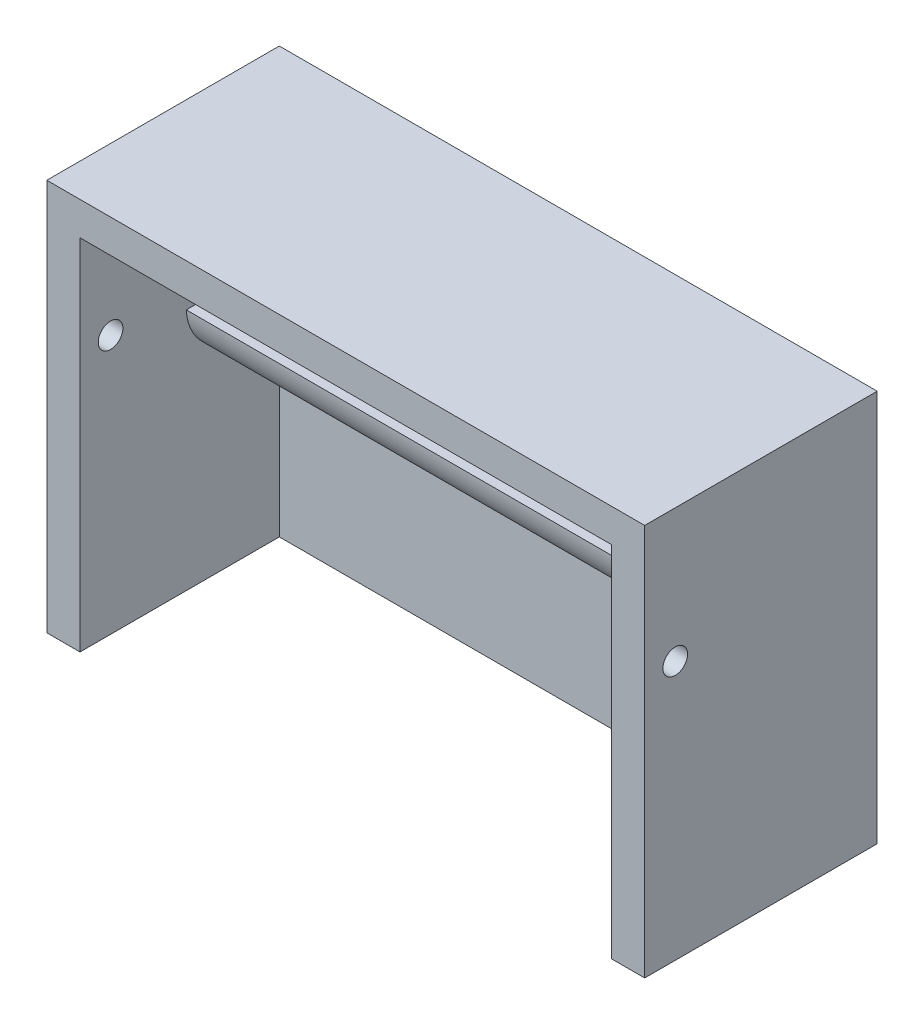
ISO-10303-21;
HEADER;
FILE_DESCRIPTION(('STEP AP214'),'2;1');
FILE_NAME('part.step','',(''),(''),'','','');
FILE_SCHEMA(('AUTOMOTIVE_DESIGN { 1 0 10303 214 1 1 1 1 }'));
ENDSEC;
DATA;
#1=APPLICATION_CONTEXT('core data for automotive mechanical design processes');
#2=APPLICATION_PROTOCOL_DEFINITION('international standard','automotive_design',2000,#1);
#3=PRODUCT_CONTEXT('',#1,'mechanical');
#4=PRODUCT('Part','Part','',(#3));
#5=PRODUCT_RELATED_PRODUCT_CATEGORY('part','',(#4));
#6=PRODUCT_DEFINITION_FORMATION('','',#4);
#7=PRODUCT_DEFINITION_CONTEXT('part definition',#1,'design');
#8=PRODUCT_DEFINITION('design','',#6,#7);
#9=PRODUCT_DEFINITION_SHAPE('','',#8);
#10=(LENGTH_UNIT() NAMED_UNIT(*) SI_UNIT(.MILLI.,.METRE.));
#11=(NAMED_UNIT(*) PLANE_ANGLE_UNIT() SI_UNIT($,.RADIAN.));
#12=(NAMED_UNIT(*) SI_UNIT($,.STERADIAN.) SOLID_ANGLE_UNIT());
#13=UNCERTAINTY_MEASURE_WITH_UNIT(LENGTH_MEASURE(1.E-05),#10,'distance_accuracy_value','');
#14=(GEOMETRIC_REPRESENTATION_CONTEXT(3) GLOBAL_UNCERTAINTY_ASSIGNED_CONTEXT((#13)) GLOBAL_UNIT_ASSIGNED_CONTEXT((#10,
#11,#12)) REPRESENTATION_CONTEXT('',''));
#15=CARTESIAN_POINT('',(0.,0.,0.));
#16=DIRECTION('',(0.,0.,1.));
#17=DIRECTION('',(1.,0.,0.));
#18=AXIS2_PLACEMENT_3D('',#15,#16,#17);
#19=CARTESIAN_POINT('',(50.8,43.9310288968519,44.45));
#20=DIRECTION('',(1.,0.,0.));
#21=DIRECTION('',(0.,0.,-1.));
#22=AXIS2_PLACEMENT_3D('',#19,#20,#21);
#23=PLANE('',#22);
#24=CARTESIAN_POINT('',(50.8,24.8810288968519,38.608));
#25=DIRECTION('',(1.,0.,0.));
#26=DIRECTION('',(0.,0.,-1.));
#27=AXIS2_PLACEMENT_3D('',#24,#25,#26);
#28=CIRCLE('',#27,2.35585);
#29=CARTESIAN_POINT('',(50.8,27.2368788968519,38.608));
#30=VERTEX_POINT('',#29);
#31=EDGE_CURVE('E164',#30,#30,#28,.F.);
#32=ORIENTED_EDGE('',*,*,#31,.F.);
#33=EDGE_LOOP('',(#32));
#34=FACE_BOUND('',#33,.T.);
#35=DIRECTION('',(0.,0.,-1.));
#36=VECTOR('',#35,1.);
#37=CARTESIAN_POINT('',(50.8,21.8330288968519,24.13));
#38=LINE('',#37,#36);
#39=CARTESIAN_POINT('',(50.8,21.8330288968519,24.13));
#40=VERTEX_POINT('',#39);
#41=CARTESIAN_POINT('',(50.8,21.8330288968519,6.35));
#42=VERTEX_POINT('',#41);
#43=EDGE_CURVE('E239',#40,#42,#38,.T.);
#44=ORIENTED_EDGE('',*,*,#43,.F.);
#45=CARTESIAN_POINT('',(50.8,22.3410288968519,13.9827079474374));
#46=DIRECTION('',(1.,0.,0.));
#47=DIRECTION('',(0.,0.,-1.));
#48=AXIS2_PLACEMENT_3D('',#45,#46,#47);
#49=CIRCLE('',#48,10.16);
#50=CARTESIAN_POINT('',(50.8,12.1810288968519,13.9827079474374));
#51=VERTEX_POINT('',#50);
#52=EDGE_CURVE('E45',#40,#51,#49,.T.);
#53=ORIENTED_EDGE('',*,*,#52,.T.);
#54=DIRECTION('',(0.,0.,-1.));
#55=VECTOR('',#54,1.);
#56=CARTESIAN_POINT('',(50.8,12.1810288968519,24.13));
#57=LINE('',#56,#55);
#58=CARTESIAN_POINT('',(50.8,12.1810288968519,6.35));
#59=VERTEX_POINT('',#58);
#60=EDGE_CURVE('E237',#51,#59,#57,.T.);
#61=ORIENTED_EDGE('',*,*,#60,.T.);
#62=DIRECTION('',(0.,1.,0.));
#63=VECTOR('',#62,1.);
#64=CARTESIAN_POINT('',(50.8,-24.6489711031481,6.35));
#65=LINE('',#64,#63);
#66=CARTESIAN_POINT('',(50.8,-24.6489711031481,6.35));
#67=VERTEX_POINT('',#66);
#68=EDGE_CURVE('E173',#67,#59,#65,.T.);
#69=ORIENTED_EDGE('',*,*,#68,.F.);
#70=DIRECTION('',(0.,0.,-1.));
#71=VECTOR('',#70,1.);
#72=CARTESIAN_POINT('',(50.8,-24.6489711031481,44.45));
#73=LINE('',#72,#71);
#74=CARTESIAN_POINT('',(50.8,-24.6489711031481,44.45));
#75=VERTEX_POINT('',#74);
#76=EDGE_CURVE('E195',#75,#67,#73,.T.);
#77=ORIENTED_EDGE('',*,*,#76,.F.);
#78=DIRECTION('',(0.,-1.,0.));
#79=VECTOR('',#78,1.);
#80=CARTESIAN_POINT('',(50.8,43.9310288968519,44.45));
#81=LINE('',#80,#79);
#82=CARTESIAN_POINT('',(50.8,43.9310288968519,44.45));
#83=VERTEX_POINT('',#82);
#84=EDGE_CURVE('E183',#83,#75,#81,.T.);
#85=ORIENTED_EDGE('',*,*,#84,.F.);
#86=DIRECTION('',(0.,0.,-1.));
#87=VECTOR('',#86,1.);
#88=CARTESIAN_POINT('',(50.8,43.9310288968519,44.45));
#89=LINE('',#88,#87);
#90=CARTESIAN_POINT('',(50.8,43.9310288968519,6.35));
#91=VERTEX_POINT('',#90);
#92=EDGE_CURVE('E198',#83,#91,#89,.T.);
#93=ORIENTED_EDGE('',*,*,#92,.T.);
#94=EDGE_CURVE('E170',#42,#91,#65,.T.);
#95=ORIENTED_EDGE('',*,*,#94,.F.);
#96=EDGE_LOOP('',(#44,#53,#61,#69,#77,#85,#93,#95));
#97=FACE_BOUND('',#96,.T.);
#98=ADVANCED_FACE('F37',(#34,#97),#23,.F.);
#99=CARTESIAN_POINT('',(0.,-24.6489711031481,6.35));
#100=DIRECTION('',(0.,0.,-1.));
#101=DIRECTION('',(-1.,0.,0.));
#102=AXIS2_PLACEMENT_3D('',#99,#100,#101);
#103=PLANE('',#102);
#104=DIRECTION('',(1.,0.,0.));
#105=VECTOR('',#104,1.);
#106=CARTESIAN_POINT('',(-50.8,12.1810288968519,6.35));
#107=LINE('',#106,#105);
#108=CARTESIAN_POINT('',(-50.8,12.1810288968519,6.35));
#109=VERTEX_POINT('',#108);
#110=EDGE_CURVE('E225',#109,#59,#107,.T.);
#111=ORIENTED_EDGE('',*,*,#110,.F.);
#112=DIRECTION('',(0.,1.,0.));
#113=VECTOR('',#112,1.);
#114=CARTESIAN_POINT('',(-50.8,-24.6489711031481,6.35));
#115=LINE('',#114,#113);
#116=CARTESIAN_POINT('',(-50.8,-24.6489711031481,6.35));
#117=VERTEX_POINT('',#116);
#118=EDGE_CURVE('E156',#117,#109,#115,.T.);
#119=ORIENTED_EDGE('',*,*,#118,.F.);
#120=DIRECTION('',(-1.,0.,0.));
#121=VECTOR('',#120,1.);
#122=CARTESIAN_POINT('',(0.,-24.6489711031481,6.35));
#123=LINE('',#122,#121);
#124=EDGE_CURVE('E168',#67,#117,#123,.T.);
#125=ORIENTED_EDGE('',*,*,#124,.F.);
#126=ORIENTED_EDGE('',*,*,#68,.T.);
#127=EDGE_LOOP('',(#111,#119,#125,#126));
#128=FACE_BOUND('',#127,.T.);
#129=ADVANCED_FACE('F222',(#128),#103,.F.);
#130=DIRECTION('',(-1.,0.,0.));
#131=VECTOR('',#130,1.);
#132=CARTESIAN_POINT('',(-50.8,21.8330288968519,6.35));
#133=LINE('',#132,#131);
#134=CARTESIAN_POINT('',(-50.8,21.8330288968519,6.35));
#135=VERTEX_POINT('',#134);
#136=EDGE_CURVE('E245',#42,#135,#133,.T.);
#137=ORIENTED_EDGE('',*,*,#136,.F.);
#138=ORIENTED_EDGE('',*,*,#94,.T.);
#139=DIRECTION('',(-1.,0.,0.));
#140=VECTOR('',#139,1.);
#141=CARTESIAN_POINT('',(0.,43.9310288968519,6.35));
#142=LINE('',#141,#140);
#143=CARTESIAN_POINT('',(-50.8,43.9310288968519,6.35));
#144=VERTEX_POINT('',#143);
#145=EDGE_CURVE('E167',#91,#144,#142,.T.);
#146=ORIENTED_EDGE('',*,*,#145,.T.);
#147=EDGE_CURVE('E227',#135,#144,#115,.T.);
#148=ORIENTED_EDGE('',*,*,#147,.F.);
#149=EDGE_LOOP('',(#137,#138,#146,#148));
#150=FACE_BOUND('',#149,.T.);
#151=ADVANCED_FACE('F260',(#150),#103,.F.);
#152=CARTESIAN_POINT('',(-50.8,43.9310288968519,44.45));
#153=DIRECTION('',(1.,0.,0.));
#154=DIRECTION('',(0.,0.,-1.));
#155=AXIS2_PLACEMENT_3D('',#152,#153,#154);
#156=PLANE('',#155);
#157=CARTESIAN_POINT('',(-50.8,24.8810288968519,38.608));
#158=DIRECTION('',(1.,0.,0.));
#159=DIRECTION('',(0.,0.,-1.));
#160=AXIS2_PLACEMENT_3D('',#157,#158,#159);
#161=CIRCLE('',#160,2.35585);
#162=CARTESIAN_POINT('',(-50.8,24.8810288968519,36.25215));
#163=VERTEX_POINT('',#162);
#164=EDGE_CURVE('E228',#163,#163,#161,.T.);
#165=ORIENTED_EDGE('',*,*,#164,.F.);
#166=EDGE_LOOP('',(#165));
#167=FACE_BOUND('',#166,.T.);
#168=ORIENTED_EDGE('',*,*,#118,.T.);
#169=DIRECTION('',(0.,0.,-1.));
#170=VECTOR('',#169,1.);
#171=CARTESIAN_POINT('',(-50.8,12.1810288968519,24.13));
#172=LINE('',#171,#170);
#173=CARTESIAN_POINT('',(-50.8,12.1810288968519,13.9827079474374));
#174=VERTEX_POINT('',#173);
#175=EDGE_CURVE('E235',#174,#109,#172,.T.);
#176=ORIENTED_EDGE('',*,*,#175,.F.);
#177=CARTESIAN_POINT('',(-50.8,22.3410288968519,13.9827079474374));
#178=DIRECTION('',(1.,0.,0.));
#179=DIRECTION('',(0.,0.,-1.));
#180=AXIS2_PLACEMENT_3D('',#177,#178,#179);
#181=CIRCLE('',#180,10.16);
#182=CARTESIAN_POINT('',(-50.8,21.8330288968519,24.13));
#183=VERTEX_POINT('',#182);
#184=EDGE_CURVE('E11',#174,#183,#181,.F.);
#185=ORIENTED_EDGE('',*,*,#184,.T.);
#186=DIRECTION('',(0.,0.,-1.));
#187=VECTOR('',#186,1.);
#188=CARTESIAN_POINT('',(-50.8,21.8330288968519,24.13));
#189=LINE('',#188,#187);
#190=EDGE_CURVE('E242',#183,#135,#189,.T.);
#191=ORIENTED_EDGE('',*,*,#190,.T.);
#192=ORIENTED_EDGE('',*,*,#147,.T.);
#193=DIRECTION('',(0.,0.,-1.));
#194=VECTOR('',#193,1.);
#195=CARTESIAN_POINT('',(-50.8,43.9310288968519,44.45));
#196=LINE('',#195,#194);
#197=CARTESIAN_POINT('',(-50.8,43.9310288968519,44.45));
#198=VERTEX_POINT('',#197);
#199=EDGE_CURVE('E158',#198,#144,#196,.T.);
#200=ORIENTED_EDGE('',*,*,#199,.F.);
#201=DIRECTION('',(0.,-1.,0.));
#202=VECTOR('',#201,1.);
#203=CARTESIAN_POINT('',(-50.8,43.9310288968519,44.45));
#204=LINE('',#203,#202);
#205=CARTESIAN_POINT('',(-50.8,-24.6489711031481,44.45));
#206=VERTEX_POINT('',#205);
#207=EDGE_CURVE('E149',#198,#206,#204,.T.);
#208=ORIENTED_EDGE('',*,*,#207,.T.);
#209=DIRECTION('',(0.,0.,-1.));
#210=VECTOR('',#209,1.);
#211=CARTESIAN_POINT('',(-50.8,-24.6489711031481,44.45));
#212=LINE('',#211,#210);
#213=EDGE_CURVE('E135',#206,#117,#212,.T.);
#214=ORIENTED_EDGE('',*,*,#213,.T.);
#215=EDGE_LOOP('',(#168,#176,#185,#191,#192,#200,#208,#214));
#216=FACE_BOUND('',#215,.T.);
#217=ADVANCED_FACE('F257',(#167,#216),#156,.T.);
#218=CARTESIAN_POINT('',(0.,43.9310288968519,44.45));
#219=DIRECTION('',(0.,1.,0.));
#220=DIRECTION('',(0.,0.,1.));
#221=AXIS2_PLACEMENT_3D('',#218,#219,#220);
#222=PLANE('',#221);
#223=ORIENTED_EDGE('',*,*,#199,.T.);
#224=ORIENTED_EDGE('',*,*,#145,.F.);
#225=ORIENTED_EDGE('',*,*,#92,.F.);
#226=DIRECTION('',(1.,0.,0.));
#227=VECTOR('',#226,1.);
#228=CARTESIAN_POINT('',(0.,43.9310288968519,44.45));
#229=LINE('',#228,#227);
#230=EDGE_CURVE('E181',#198,#83,#229,.T.);
#231=ORIENTED_EDGE('',*,*,#230,.F.);
#232=EDGE_LOOP('',(#223,#224,#225,#231));
#233=FACE_BOUND('',#232,.T.);
#234=ADVANCED_FACE('F264',(#233),#222,.F.);
#235=CARTESIAN_POINT('',(57.15,-24.6489711031481,44.45));
#236=DIRECTION('',(-1.,0.,0.));
#237=DIRECTION('',(0.,-1.,0.));
#238=AXIS2_PLACEMENT_3D('',#235,#236,#237);
#239=PLANE('',#238);
#240=CARTESIAN_POINT('',(57.15,24.8810288968519,38.608));
#241=DIRECTION('',(1.,0.,0.));
#242=DIRECTION('',(0.,1.,0.));
#243=AXIS2_PLACEMENT_3D('',#240,#241,#242);
#244=CIRCLE('',#243,2.35585);
#245=CARTESIAN_POINT('',(57.15,27.2368788968519,38.608));
#246=VERTEX_POINT('',#245);
#247=EDGE_CURVE('E134',#246,#246,#244,.T.);
#248=ORIENTED_EDGE('',*,*,#247,.F.);
#249=EDGE_LOOP('',(#248));
#250=FACE_BOUND('',#249,.T.);
#251=DIRECTION('',(0.,1.,0.));
#252=VECTOR('',#251,1.);
#253=CARTESIAN_POINT('',(57.15,-24.6489711031481,0.));
#254=LINE('',#253,#252);
#255=CARTESIAN_POINT('',(57.15,-24.6489711031481,0.));
#256=VERTEX_POINT('',#255);
#257=CARTESIAN_POINT('',(57.15,50.2810288968519,0.));
#258=VERTEX_POINT('',#257);
#259=EDGE_CURVE('E176',#256,#258,#254,.T.);
#260=ORIENTED_EDGE('',*,*,#259,.T.);
#261=DIRECTION('',(0.,0.,-1.));
#262=VECTOR('',#261,1.);
#263=CARTESIAN_POINT('',(57.15,50.2810288968519,44.45));
#264=LINE('',#263,#262);
#265=CARTESIAN_POINT('',(57.15,50.2810288968519,44.45));
#266=VERTEX_POINT('',#265);
#267=EDGE_CURVE('E201',#266,#258,#264,.T.);
#268=ORIENTED_EDGE('',*,*,#267,.F.);
#269=DIRECTION('',(0.,1.,0.));
#270=VECTOR('',#269,1.);
#271=CARTESIAN_POINT('',(57.15,-24.6489711031481,44.45));
#272=LINE('',#271,#270);
#273=CARTESIAN_POINT('',(57.15,-24.6489711031481,44.45));
#274=VERTEX_POINT('',#273);
#275=EDGE_CURVE('E177',#274,#266,#272,.T.);
#276=ORIENTED_EDGE('',*,*,#275,.F.);
#277=DIRECTION('',(0.,0.,-1.));
#278=VECTOR('',#277,1.);
#279=CARTESIAN_POINT('',(57.15,-24.6489711031481,44.45));
#280=LINE('',#279,#278);
#281=EDGE_CURVE('E187',#274,#256,#280,.T.);
#282=ORIENTED_EDGE('',*,*,#281,.T.);
#283=EDGE_LOOP('',(#260,#268,#276,#282));
#284=FACE_BOUND('',#283,.T.);
#285=ADVANCED_FACE('F210',(#250,#284),#239,.F.);
#286=CARTESIAN_POINT('',(57.15,50.2810288968519,44.45));
#287=DIRECTION('',(0.,-1.,0.));
#288=DIRECTION('',(1.,0.,0.));
#289=AXIS2_PLACEMENT_3D('',#286,#287,#288);
#290=PLANE('',#289);
#291=DIRECTION('',(-1.,0.,0.));
#292=VECTOR('',#291,1.);
#293=CARTESIAN_POINT('',(57.15,50.2810288968519,0.));
#294=LINE('',#293,#292);
#295=CARTESIAN_POINT('',(-57.15,50.2810288968519,0.));
#296=VERTEX_POINT('',#295);
#297=EDGE_CURVE('E190',#258,#296,#294,.T.);
#298=ORIENTED_EDGE('',*,*,#297,.T.);
#299=DIRECTION('',(0.,0.,-1.));
#300=VECTOR('',#299,1.);
#301=CARTESIAN_POINT('',(-57.15,50.2810288968519,44.45));
#302=LINE('',#301,#300);
#303=CARTESIAN_POINT('',(-57.15,50.2810288968519,44.45));
#304=VERTEX_POINT('',#303);
#305=EDGE_CURVE('E151',#304,#296,#302,.T.);
#306=ORIENTED_EDGE('',*,*,#305,.F.);
#307=DIRECTION('',(-1.,0.,0.));
#308=VECTOR('',#307,1.);
#309=CARTESIAN_POINT('',(57.15,50.2810288968519,44.45));
#310=LINE('',#309,#308);
#311=EDGE_CURVE('E144',#266,#304,#310,.T.);
#312=ORIENTED_EDGE('',*,*,#311,.F.);
#313=ORIENTED_EDGE('',*,*,#267,.T.);
#314=EDGE_LOOP('',(#298,#306,#312,#313));
#315=FACE_BOUND('',#314,.T.);
#316=ADVANCED_FACE('F206',(#315),#290,.F.);
#317=CARTESIAN_POINT('',(50.8,-24.6489711031481,44.45));
#318=DIRECTION('',(0.,1.,0.));
#319=DIRECTION('',(0.,0.,1.));
#320=AXIS2_PLACEMENT_3D('',#317,#318,#319);
#321=PLANE('',#320);
#322=DIRECTION('',(1.,0.,0.));
#323=VECTOR('',#322,1.);
#324=CARTESIAN_POINT('',(50.8,-24.6489711031481,0.));
#325=LINE('',#324,#323);
#326=CARTESIAN_POINT('',(-57.15,-24.6489711031481,0.));
#327=VERTEX_POINT('',#326);
#328=EDGE_CURVE('E179',#327,#256,#325,.T.);
#329=ORIENTED_EDGE('',*,*,#328,.T.);
#330=ORIENTED_EDGE('',*,*,#281,.F.);
#331=DIRECTION('',(1.,0.,0.));
#332=VECTOR('',#331,1.);
#333=CARTESIAN_POINT('',(50.8,-24.6489711031481,44.45));
#334=LINE('',#333,#332);
#335=EDGE_CURVE('E185',#75,#274,#334,.T.);
#336=ORIENTED_EDGE('',*,*,#335,.F.);
#337=ORIENTED_EDGE('',*,*,#76,.T.);
#338=ORIENTED_EDGE('',*,*,#124,.T.);
#339=ORIENTED_EDGE('',*,*,#213,.F.);
#340=DIRECTION('',(-1.,0.,0.));
#341=VECTOR('',#340,1.);
#342=CARTESIAN_POINT('',(-50.8,-24.6489711031481,44.45));
#343=LINE('',#342,#341);
#344=CARTESIAN_POINT('',(-57.15,-24.6489711031481,44.45));
#345=VERTEX_POINT('',#344);
#346=EDGE_CURVE('E142',#206,#345,#343,.T.);
#347=ORIENTED_EDGE('',*,*,#346,.T.);
#348=DIRECTION('',(0.,0.,-1.));
#349=VECTOR('',#348,1.);
#350=CARTESIAN_POINT('',(-57.15,-24.6489711031481,44.45));
#351=LINE('',#350,#349);
#352=EDGE_CURVE('E125',#345,#327,#351,.T.);
#353=ORIENTED_EDGE('',*,*,#352,.T.);
#354=EDGE_LOOP('',(#329,#330,#336,#337,#338,#339,#347,#353));
#355=FACE_BOUND('',#354,.T.);
#356=ADVANCED_FACE('F147',(#355),#321,.F.);
#357=CARTESIAN_POINT('',(0.,0.,44.45));
#358=DIRECTION('',(0.,0.,1.));
#359=DIRECTION('',(1.,0.,0.));
#360=AXIS2_PLACEMENT_3D('',#357,#358,#359);
#361=PLANE('',#360);
#362=ORIENTED_EDGE('',*,*,#275,.T.);
#363=ORIENTED_EDGE('',*,*,#311,.T.);
#364=DIRECTION('',(0.,1.,0.));
#365=VECTOR('',#364,1.);
#366=CARTESIAN_POINT('',(-57.15,-24.6489711031481,44.45));
#367=LINE('',#366,#365);
#368=EDGE_CURVE('E129',#345,#304,#367,.T.);
#369=ORIENTED_EDGE('',*,*,#368,.F.);
#370=ORIENTED_EDGE('',*,*,#346,.F.);
#371=ORIENTED_EDGE('',*,*,#207,.F.);
#372=ORIENTED_EDGE('',*,*,#230,.T.);
#373=ORIENTED_EDGE('',*,*,#84,.T.);
#374=ORIENTED_EDGE('',*,*,#335,.T.);
#375=EDGE_LOOP('',(#362,#363,#369,#370,#371,#372,#373,#374));
#376=FACE_BOUND('',#375,.T.);
#377=ADVANCED_FACE('F140',(#376),#361,.T.);
#378=CARTESIAN_POINT('',(0.,0.,0.));
#379=DIRECTION('',(0.,0.,1.));
#380=DIRECTION('',(1.,0.,0.));
#381=AXIS2_PLACEMENT_3D('',#378,#379,#380);
#382=PLANE('',#381);
#383=ORIENTED_EDGE('',*,*,#328,.F.);
#384=DIRECTION('',(0.,1.,0.));
#385=VECTOR('',#384,1.);
#386=CARTESIAN_POINT('',(-57.15,-24.6489711031481,0.));
#387=LINE('',#386,#385);
#388=EDGE_CURVE('E131',#327,#296,#387,.T.);
#389=ORIENTED_EDGE('',*,*,#388,.T.);
#390=ORIENTED_EDGE('',*,*,#297,.F.);
#391=ORIENTED_EDGE('',*,*,#259,.F.);
#392=EDGE_LOOP('',(#383,#389,#390,#391));
#393=FACE_BOUND('',#392,.T.);
#394=ADVANCED_FACE('F213',(#393),#382,.F.);
#395=CARTESIAN_POINT('',(-0.00100000000000794,24.8810288968519,38.608));
#396=DIRECTION('',(1.,0.,0.));
#397=DIRECTION('',(0.,1.,0.));
#398=AXIS2_PLACEMENT_3D('',#395,#396,#397);
#399=CYLINDRICAL_SURFACE('',#398,2.35585);
#400=CARTESIAN_POINT('',(57.15,27.2368788968519,38.608));
#401=CARTESIAN_POINT('',(57.0838541666667,27.2368788968519,38.608));
#402=CARTESIAN_POINT('',(57.0177083333333,27.2368788968519,38.608));
#403=CARTESIAN_POINT('',(56.8854166666667,27.2368788968519,38.608));
#404=CARTESIAN_POINT('',(56.8192708333333,27.2368788968519,38.608));
#405=CARTESIAN_POINT('',(56.6869791666667,27.2368788968519,38.608));
#406=CARTESIAN_POINT('',(56.6208333333333,27.2368788968519,38.608));
#407=CARTESIAN_POINT('',(56.4885416666667,27.2368788968519,38.608));
#408=CARTESIAN_POINT('',(56.4223958333333,27.2368788968519,38.608));
#409=CARTESIAN_POINT('',(56.2901041666667,27.2368788968519,38.608));
#410=CARTESIAN_POINT('',(56.2239583333333,27.2368788968519,38.608));
#411=CARTESIAN_POINT('',(56.0916666666667,27.2368788968519,38.608));
#412=CARTESIAN_POINT('',(56.0255208333333,27.2368788968519,38.608));
#413=CARTESIAN_POINT('',(55.8932291666667,27.2368788968519,38.608));
#414=CARTESIAN_POINT('',(55.8270833333333,27.2368788968519,38.608));
#415=CARTESIAN_POINT('',(55.6947916666667,27.2368788968519,38.608));
#416=CARTESIAN_POINT('',(55.6286458333333,27.2368788968519,38.608));
#417=CARTESIAN_POINT('',(55.4963541666667,27.2368788968519,38.608));
#418=CARTESIAN_POINT('',(55.4302083333333,27.2368788968519,38.608));
#419=CARTESIAN_POINT('',(55.2979166666667,27.2368788968519,38.608));
#420=CARTESIAN_POINT('',(55.2317708333333,27.2368788968519,38.608));
#421=CARTESIAN_POINT('',(55.0994791666667,27.2368788968519,38.608));
#422=CARTESIAN_POINT('',(55.0333333333333,27.2368788968519,38.608));
#423=CARTESIAN_POINT('',(54.9010416666667,27.2368788968519,38.608));
#424=CARTESIAN_POINT('',(54.8348958333333,27.2368788968519,38.608));
#425=CARTESIAN_POINT('',(54.7026041666667,27.2368788968519,38.608));
#426=CARTESIAN_POINT('',(54.6364583333333,27.2368788968519,38.608));
#427=CARTESIAN_POINT('',(54.5041666666667,27.2368788968519,38.608));
#428=CARTESIAN_POINT('',(54.4380208333333,27.2368788968519,38.608));
#429=CARTESIAN_POINT('',(54.3057291666667,27.2368788968519,38.608));
#430=CARTESIAN_POINT('',(54.2395833333333,27.2368788968519,38.608));
#431=CARTESIAN_POINT('',(54.1072916666667,27.2368788968519,38.608));
#432=CARTESIAN_POINT('',(54.0411458333333,27.2368788968519,38.608));
#433=CARTESIAN_POINT('',(53.9088541666667,27.2368788968519,38.608));
#434=CARTESIAN_POINT('',(53.8427083333333,27.2368788968519,38.608));
#435=CARTESIAN_POINT('',(53.7104166666667,27.2368788968519,38.608));
#436=CARTESIAN_POINT('',(53.6442708333333,27.2368788968519,38.608));
#437=CARTESIAN_POINT('',(53.5119791666667,27.2368788968519,38.608));
#438=CARTESIAN_POINT('',(53.4458333333333,27.2368788968519,38.608));
#439=CARTESIAN_POINT('',(53.3135416666667,27.2368788968519,38.608));
#440=CARTESIAN_POINT('',(53.2473958333333,27.2368788968519,38.608));
#441=CARTESIAN_POINT('',(53.1151041666667,27.2368788968519,38.608));
#442=CARTESIAN_POINT('',(53.0489583333333,27.2368788968519,38.608));
#443=CARTESIAN_POINT('',(52.9166666666667,27.2368788968519,38.608));
#444=CARTESIAN_POINT('',(52.8505208333333,27.2368788968519,38.608));
#445=CARTESIAN_POINT('',(52.7182291666667,27.2368788968519,38.608));
#446=CARTESIAN_POINT('',(52.6520833333333,27.2368788968519,38.608));
#447=CARTESIAN_POINT('',(52.5197916666667,27.2368788968519,38.608));
#448=CARTESIAN_POINT('',(52.4536458333333,27.2368788968519,38.608));
#449=CARTESIAN_POINT('',(52.3213541666667,27.2368788968519,38.608));
#450=CARTESIAN_POINT('',(52.2552083333333,27.2368788968519,38.608));
#451=CARTESIAN_POINT('',(52.1229166666667,27.2368788968519,38.608));
#452=CARTESIAN_POINT('',(52.0567708333333,27.2368788968519,38.608));
#453=CARTESIAN_POINT('',(51.9244791666667,27.2368788968519,38.608));
#454=CARTESIAN_POINT('',(51.8583333333333,27.2368788968519,38.608));
#455=CARTESIAN_POINT('',(51.7260416666667,27.2368788968519,38.608));
#456=CARTESIAN_POINT('',(51.6598958333333,27.2368788968519,38.608));
#457=CARTESIAN_POINT('',(51.5276041666667,27.2368788968519,38.608));
#458=CARTESIAN_POINT('',(51.4614583333333,27.2368788968519,38.608));
#459=CARTESIAN_POINT('',(51.3291666666667,27.2368788968519,38.608));
#460=CARTESIAN_POINT('',(51.2630208333333,27.2368788968519,38.608));
#461=CARTESIAN_POINT('',(51.1307291666667,27.2368788968519,38.608));
#462=CARTESIAN_POINT('',(51.0645833333333,27.2368788968519,38.608));
#463=CARTESIAN_POINT('',(50.9322916666667,27.2368788968519,38.608));
#464=CARTESIAN_POINT('',(50.8661458333333,27.2368788968519,38.608));
#465=CARTESIAN_POINT('',(50.8,27.2368788968519,38.608));
#466=B_SPLINE_CURVE_WITH_KNOTS('',3,(#400,#401,#402,#403,#404,#405,#406,#407,#408,#409,#410,
#411,#412,#413,#414,#415,#416,#417,#418,#419,#420,#421,#422,#423,#424,#425,#426,#427,#428,#429,
#430,#431,#432,#433,#434,#435,#436,#437,#438,#439,#440,#441,#442,#443,#444,#445,#446,#447,#448,
#449,#450,#451,#452,#453,#454,#455,#456,#457,#458,#459,#460,#461,#462,#463,#464,#465),
.UNSPECIFIED.,.F.,.F.,(4,2,2,2,2,2,2,2,2,2,2,2,2,2,2,2,2,2,2,2,2,2,2,2,2,2,2,2,2,2,2,2,4),(0.,
0.198437500000002,0.396874999999998,0.5953125,0.793749999999996,0.992187499999998,1.190625,
1.3890625,1.5875,1.7859375,1.984375,2.1828125,2.38125,2.5796875,2.778125,2.97656249999999,3.175,
3.3734375,3.571875,3.7703125,3.96874999999999,4.1671875,4.365625,4.56406249999999,4.7625,
4.9609375,5.15937499999999,5.3578125,5.55625,5.75468749999999,5.953125,6.15156249999999,
6.34999999999999),.UNSPECIFIED.);
#467=EDGE_CURVE('BSEAM291',#246,#30,#466,.T.);
#468=ORIENTED_EDGE('',*,*,#247,.T.);
#469=ORIENTED_EDGE('',*,*,#31,.T.);
#470=ORIENTED_EDGE('',*,*,#467,.T.);
#471=ORIENTED_EDGE('',*,*,#467,.F.);
#472=EDGE_LOOP('',(#468,#470,#469,#471));
#473=FACE_BOUND('',#472,.T.);
#474=ADVANCED_FACE('F291',(#473),#399,.F.);
#475=CARTESIAN_POINT('',(-57.15,-24.6489711031481,44.45));
#476=DIRECTION('',(-1.,0.,0.));
#477=DIRECTION('',(0.,-1.,0.));
#478=AXIS2_PLACEMENT_3D('',#475,#476,#477);
#479=PLANE('',#478);
#480=CARTESIAN_POINT('',(-57.15,24.8810288968519,38.608));
#481=DIRECTION('',(1.,0.,0.));
#482=DIRECTION('',(0.,1.,0.));
#483=AXIS2_PLACEMENT_3D('',#480,#481,#482);
#484=CIRCLE('',#483,2.35585);
#485=CARTESIAN_POINT('',(-57.15,27.2368788968519,38.608));
#486=VERTEX_POINT('',#485);
#487=EDGE_CURVE('E232',#486,#486,#484,.T.);
#488=ORIENTED_EDGE('',*,*,#487,.T.);
#489=EDGE_LOOP('',(#488));
#490=FACE_BOUND('',#489,.T.);
#491=ORIENTED_EDGE('',*,*,#388,.F.);
#492=ORIENTED_EDGE('',*,*,#352,.F.);
#493=ORIENTED_EDGE('',*,*,#368,.T.);
#494=ORIENTED_EDGE('',*,*,#305,.T.);
#495=EDGE_LOOP('',(#491,#492,#493,#494));
#496=FACE_BOUND('',#495,.T.);
#497=ADVANCED_FACE('F127',(#490,#496),#479,.T.);
#498=CARTESIAN_POINT('',(57.151,24.8810288968518,38.608));
#499=DIRECTION('',(-1.,0.,0.));
#500=DIRECTION('',(0.,-1.,0.));
#501=AXIS2_PLACEMENT_3D('',#498,#499,#500);
#502=CYLINDRICAL_SURFACE('',#501,2.35585);
#503=ORIENTED_EDGE('',*,*,#164,.T.);
#504=EDGE_LOOP('',(#503));
#505=FACE_BOUND('',#504,.T.);
#506=ORIENTED_EDGE('',*,*,#487,.F.);
#507=EDGE_LOOP('',(#506));
#508=FACE_BOUND('',#507,.T.);
#509=ADVANCED_FACE('F298',(#505,#508),#502,.F.);
#510=CARTESIAN_POINT('',(-50.8,12.1810288968519,24.13));
#511=DIRECTION('',(0.,1.,0.));
#512=DIRECTION('',(0.,0.,1.));
#513=AXIS2_PLACEMENT_3D('',#510,#511,#512);
#514=PLANE('',#513);
#515=ORIENTED_EDGE('',*,*,#60,.F.);
#516=DIRECTION('',(1.,0.,0.));
#517=VECTOR('',#516,1.);
#518=CARTESIAN_POINT('',(-50.8,12.1810288968519,13.9827079474374));
#519=LINE('',#518,#517);
#520=EDGE_CURVE('E52',#51,#174,#519,.F.);
#521=ORIENTED_EDGE('',*,*,#520,.T.);
#522=ORIENTED_EDGE('',*,*,#175,.T.);
#523=ORIENTED_EDGE('',*,*,#110,.T.);
#524=EDGE_LOOP('',(#515,#521,#522,#523));
#525=FACE_BOUND('',#524,.T.);
#526=ADVANCED_FACE('F303',(#525),#514,.F.);
#527=CARTESIAN_POINT('',(-50.8,21.8330288968519,24.13));
#528=DIRECTION('',(0.,-1.,0.));
#529=DIRECTION('',(0.,0.,-1.));
#530=AXIS2_PLACEMENT_3D('',#527,#528,#529);
#531=PLANE('',#530);
#532=ORIENTED_EDGE('',*,*,#136,.T.);
#533=ORIENTED_EDGE('',*,*,#190,.F.);
#534=DIRECTION('',(-1.,0.,0.));
#535=VECTOR('',#534,1.);
#536=CARTESIAN_POINT('',(-50.8,21.8330288968519,24.13));
#537=LINE('',#536,#535);
#538=EDGE_CURVE('E244',#40,#183,#537,.T.);
#539=ORIENTED_EDGE('',*,*,#538,.F.);
#540=ORIENTED_EDGE('',*,*,#43,.T.);
#541=EDGE_LOOP('',(#532,#533,#539,#540));
#542=FACE_BOUND('',#541,.T.);
#543=ADVANCED_FACE('F255',(#542),#531,.F.);
#544=CARTESIAN_POINT('',(0.,22.3410288968519,13.9827079474374));
#545=DIRECTION('',(1.,0.,0.));
#546=DIRECTION('',(0.,0.,-1.));
#547=AXIS2_PLACEMENT_3D('',#544,#545,#546);
#548=CYLINDRICAL_SURFACE('',#547,10.16);
#549=ORIENTED_EDGE('',*,*,#184,.F.);
#550=ORIENTED_EDGE('',*,*,#520,.F.);
#551=ORIENTED_EDGE('',*,*,#52,.F.);
#552=ORIENTED_EDGE('',*,*,#538,.T.);
#553=EDGE_LOOP('',(#549,#550,#551,#552));
#554=FACE_BOUND('',#553,.T.);
#555=ADVANCED_FACE('F39',(#554),#548,.T.);
#556=CLOSED_SHELL('',(#98,#129,#151,#217,#234,#285,#316,#356,#377,#394,#474,#497,#509,#526,#543,#555));
#557=MANIFOLD_SOLID_BREP('B2',#556);
#558=ADVANCED_BREP_SHAPE_REPRESENTATION('',(#18,#557),#14);
#559=SHAPE_DEFINITION_REPRESENTATION(#9,#558);
ENDSEC;
END-ISO-10303-21;
